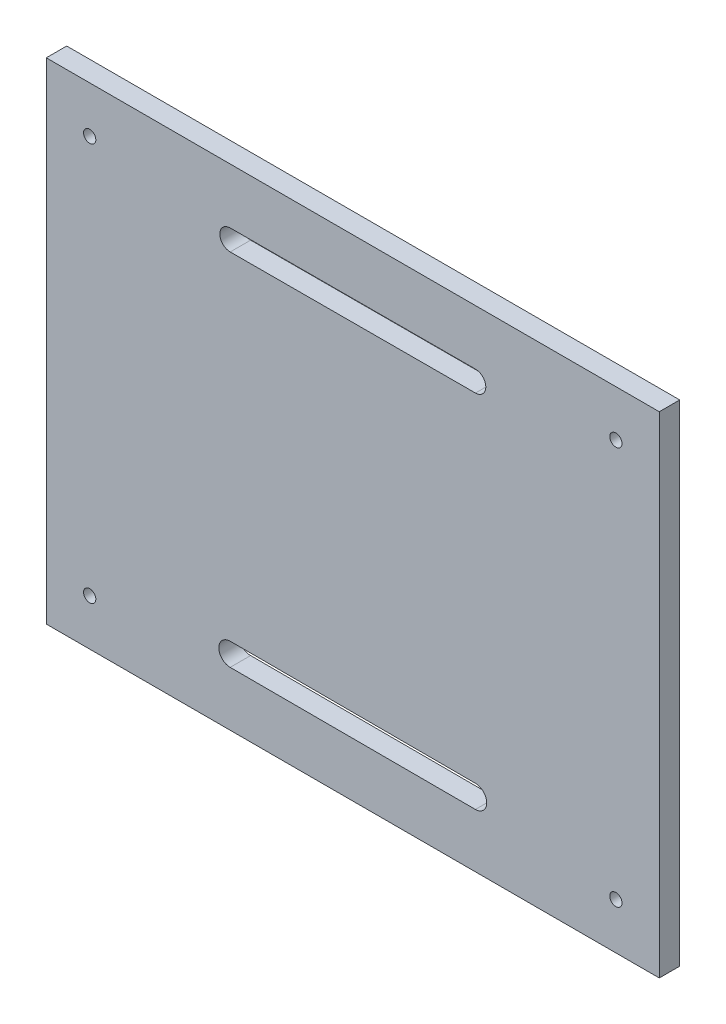
ISO-10303-21;
HEADER;
FILE_DESCRIPTION(('STEP AP214'),'2;1');
FILE_NAME('part.step','',(''),(''),'','','');
FILE_SCHEMA(('AUTOMOTIVE_DESIGN { 1 0 10303 214 1 1 1 1 }'));
ENDSEC;
DATA;
#1=APPLICATION_CONTEXT('core data for automotive mechanical design processes');
#2=APPLICATION_PROTOCOL_DEFINITION('international standard','automotive_design',2000,#1);
#3=PRODUCT_CONTEXT('',#1,'mechanical');
#4=PRODUCT('Part','Part','',(#3));
#5=PRODUCT_RELATED_PRODUCT_CATEGORY('part','',(#4));
#6=PRODUCT_DEFINITION_FORMATION('','',#4);
#7=PRODUCT_DEFINITION_CONTEXT('part definition',#1,'design');
#8=PRODUCT_DEFINITION('design','',#6,#7);
#9=PRODUCT_DEFINITION_SHAPE('','',#8);
#10=(LENGTH_UNIT() NAMED_UNIT(*) SI_UNIT(.MILLI.,.METRE.));
#11=(NAMED_UNIT(*) PLANE_ANGLE_UNIT() SI_UNIT($,.RADIAN.));
#12=(NAMED_UNIT(*) SI_UNIT($,.STERADIAN.) SOLID_ANGLE_UNIT());
#13=UNCERTAINTY_MEASURE_WITH_UNIT(LENGTH_MEASURE(1.E-05),#10,'distance_accuracy_value','');
#14=(GEOMETRIC_REPRESENTATION_CONTEXT(3) GLOBAL_UNCERTAINTY_ASSIGNED_CONTEXT((#13)) GLOBAL_UNIT_ASSIGNED_CONTEXT((#10,
#11,#12)) REPRESENTATION_CONTEXT('',''));
#15=CARTESIAN_POINT('',(0.,0.,0.));
#16=DIRECTION('',(0.,0.,1.));
#17=DIRECTION('',(1.,0.,0.));
#18=AXIS2_PLACEMENT_3D('',#15,#16,#17);
#19=CARTESIAN_POINT('',(0.,129.1430839934,5.));
#20=DIRECTION('',(0.,-1.,0.));
#21=DIRECTION('',(0.,0.,-1.));
#22=AXIS2_PLACEMENT_3D('',#19,#20,#21);
#23=PLANE('',#22);
#24=DIRECTION('',(-1.,0.,0.));
#25=VECTOR('',#24,1.);
#26=CARTESIAN_POINT('',(0.,129.1430839934,0.));
#27=LINE('',#26,#25);
#28=CARTESIAN_POINT('',(161.55561228383,129.1430839934,0.));
#29=VERTEX_POINT('',#28);
#30=CARTESIAN_POINT('',(11.5556122838298,129.1430839934,0.));
#31=VERTEX_POINT('',#30);
#32=EDGE_CURVE('E229',#29,#31,#27,.T.);
#33=ORIENTED_EDGE('',*,*,#32,.T.);
#34=DIRECTION('',(0.,0.,-1.));
#35=VECTOR('',#34,1.);
#36=CARTESIAN_POINT('',(11.5556122838298,129.1430839934,5.));
#37=LINE('',#36,#35);
#38=CARTESIAN_POINT('',(11.5556122838298,129.1430839934,5.));
#39=VERTEX_POINT('',#38);
#40=EDGE_CURVE('E11',#39,#31,#37,.T.);
#41=ORIENTED_EDGE('',*,*,#40,.F.);
#42=DIRECTION('',(-1.,0.,0.));
#43=VECTOR('',#42,1.);
#44=CARTESIAN_POINT('',(0.,129.1430839934,5.));
#45=LINE('',#44,#43);
#46=CARTESIAN_POINT('',(161.55561228383,129.1430839934,5.));
#47=VERTEX_POINT('',#46);
#48=EDGE_CURVE('E208',#47,#39,#45,.T.);
#49=ORIENTED_EDGE('',*,*,#48,.F.);
#50=DIRECTION('',(0.,0.,-1.));
#51=VECTOR('',#50,1.);
#52=CARTESIAN_POINT('',(161.55561228383,129.1430839934,5.));
#53=LINE('',#52,#51);
#54=EDGE_CURVE('E217',#47,#29,#53,.T.);
#55=ORIENTED_EDGE('',*,*,#54,.T.);
#56=EDGE_LOOP('',(#33,#41,#49,#55));
#57=FACE_BOUND('',#56,.T.);
#58=ADVANCED_FACE('F37',(#57),#23,.F.);
#59=CARTESIAN_POINT('',(11.5556122838298,0.,5.));
#60=DIRECTION('',(1.,0.,0.));
#61=DIRECTION('',(0.,0.,-1.));
#62=AXIS2_PLACEMENT_3D('',#59,#60,#61);
#63=PLANE('',#62);
#64=DIRECTION('',(0.,-1.,0.));
#65=VECTOR('',#64,1.);
#66=CARTESIAN_POINT('',(11.5556122838298,0.,0.));
#67=LINE('',#66,#65);
#68=CARTESIAN_POINT('',(11.5556122838298,9.14308399340018,0.));
#69=VERTEX_POINT('',#68);
#70=EDGE_CURVE('E232',#31,#69,#67,.T.);
#71=ORIENTED_EDGE('',*,*,#70,.T.);
#72=DIRECTION('',(0.,0.,-1.));
#73=VECTOR('',#72,1.);
#74=CARTESIAN_POINT('',(11.5556122838298,9.14308399340018,5.));
#75=LINE('',#74,#73);
#76=CARTESIAN_POINT('',(11.5556122838298,9.14308399340018,5.));
#77=VERTEX_POINT('',#76);
#78=EDGE_CURVE('E45',#77,#69,#75,.T.);
#79=ORIENTED_EDGE('',*,*,#78,.F.);
#80=DIRECTION('',(0.,-1.,0.));
#81=VECTOR('',#80,1.);
#82=CARTESIAN_POINT('',(11.5556122838298,0.,5.));
#83=LINE('',#82,#81);
#84=EDGE_CURVE('E211',#39,#77,#83,.T.);
#85=ORIENTED_EDGE('',*,*,#84,.F.);
#86=ORIENTED_EDGE('',*,*,#40,.T.);
#87=EDGE_LOOP('',(#71,#79,#85,#86));
#88=FACE_BOUND('',#87,.T.);
#89=ADVANCED_FACE('F261',(#88),#63,.F.);
#90=CARTESIAN_POINT('',(0.,9.14308399340018,5.));
#91=DIRECTION('',(0.,1.,0.));
#92=DIRECTION('',(-1.,0.,0.));
#93=AXIS2_PLACEMENT_3D('',#90,#91,#92);
#94=PLANE('',#93);
#95=DIRECTION('',(1.,0.,0.));
#96=VECTOR('',#95,1.);
#97=CARTESIAN_POINT('',(0.,9.14308399340018,0.));
#98=LINE('',#97,#96);
#99=CARTESIAN_POINT('',(161.55561228383,9.14308399340018,0.));
#100=VERTEX_POINT('',#99);
#101=EDGE_CURVE('E234',#69,#100,#98,.T.);
#102=ORIENTED_EDGE('',*,*,#101,.T.);
#103=DIRECTION('',(0.,0.,-1.));
#104=VECTOR('',#103,1.);
#105=CARTESIAN_POINT('',(161.55561228383,9.14308399340018,5.));
#106=LINE('',#105,#104);
#107=CARTESIAN_POINT('',(161.55561228383,9.14308399340018,5.));
#108=VERTEX_POINT('',#107);
#109=EDGE_CURVE('E239',#108,#100,#106,.T.);
#110=ORIENTED_EDGE('',*,*,#109,.F.);
#111=DIRECTION('',(1.,0.,0.));
#112=VECTOR('',#111,1.);
#113=CARTESIAN_POINT('',(0.,9.14308399340018,5.));
#114=LINE('',#113,#112);
#115=EDGE_CURVE('E213',#77,#108,#114,.T.);
#116=ORIENTED_EDGE('',*,*,#115,.F.);
#117=ORIENTED_EDGE('',*,*,#78,.T.);
#118=EDGE_LOOP('',(#102,#110,#116,#117));
#119=FACE_BOUND('',#118,.T.);
#120=ADVANCED_FACE('F246',(#119),#94,.F.);
#121=CARTESIAN_POINT('',(22.1789860171417,117.822854056985,5.));
#122=DIRECTION('',(0.,0.,-1.));
#123=DIRECTION('',(-1.,0.,0.));
#124=AXIS2_PLACEMENT_3D('',#121,#122,#123);
#125=CYLINDRICAL_SURFACE('',#124,1.5);
#126=CARTESIAN_POINT('',(22.1789860171417,117.822854056985,5.));
#127=DIRECTION('',(0.,0.,1.));
#128=DIRECTION('',(1.,0.,0.));
#129=AXIS2_PLACEMENT_3D('',#126,#127,#128);
#130=CIRCLE('',#129,1.5);
#131=CARTESIAN_POINT('',(23.6789860171417,117.822854056985,5.));
#132=VERTEX_POINT('',#131);
#133=EDGE_CURVE('E205',#132,#132,#130,.T.);
#134=ORIENTED_EDGE('',*,*,#133,.T.);
#135=EDGE_LOOP('',(#134));
#136=FACE_BOUND('',#135,.T.);
#137=CARTESIAN_POINT('',(22.1789860171417,117.822854056985,0.));
#138=DIRECTION('',(0.,0.,1.));
#139=DIRECTION('',(1.,0.,0.));
#140=AXIS2_PLACEMENT_3D('',#137,#138,#139);
#141=CIRCLE('',#140,1.5);
#142=CARTESIAN_POINT('',(23.6789860171417,117.822854056985,0.));
#143=VERTEX_POINT('',#142);
#144=EDGE_CURVE('E226',#143,#143,#141,.T.);
#145=ORIENTED_EDGE('',*,*,#144,.F.);
#146=EDGE_LOOP('',(#145));
#147=FACE_BOUND('',#146,.T.);
#148=ADVANCED_FACE('F268',(#136,#147),#125,.F.);
#149=CARTESIAN_POINT('',(150.932238550518,117.822854056985,5.));
#150=DIRECTION('',(0.,0.,-1.));
#151=DIRECTION('',(-1.,0.,0.));
#152=AXIS2_PLACEMENT_3D('',#149,#150,#151);
#153=CYLINDRICAL_SURFACE('',#152,1.5);
#154=CARTESIAN_POINT('',(150.932238550518,117.822854056985,5.));
#155=DIRECTION('',(0.,0.,1.));
#156=DIRECTION('',(1.,0.,0.));
#157=AXIS2_PLACEMENT_3D('',#154,#155,#156);
#158=CIRCLE('',#157,1.5);
#159=CARTESIAN_POINT('',(152.432238550518,117.822854056985,5.));
#160=VERTEX_POINT('',#159);
#161=EDGE_CURVE('E202',#160,#160,#158,.T.);
#162=ORIENTED_EDGE('',*,*,#161,.T.);
#163=EDGE_LOOP('',(#162));
#164=FACE_BOUND('',#163,.T.);
#165=CARTESIAN_POINT('',(150.932238550518,117.822854056985,0.));
#166=DIRECTION('',(0.,0.,1.));
#167=DIRECTION('',(1.,0.,0.));
#168=AXIS2_PLACEMENT_3D('',#165,#166,#167);
#169=CIRCLE('',#168,1.5);
#170=CARTESIAN_POINT('',(152.432238550518,117.822854056985,0.));
#171=VERTEX_POINT('',#170);
#172=EDGE_CURVE('E223',#171,#171,#169,.T.);
#173=ORIENTED_EDGE('',*,*,#172,.F.);
#174=EDGE_LOOP('',(#173));
#175=FACE_BOUND('',#174,.T.);
#176=ADVANCED_FACE('F275',(#164,#175),#153,.F.);
#177=CARTESIAN_POINT('',(22.1789860171417,20.4633139298151,5.));
#178=DIRECTION('',(0.,0.,-1.));
#179=DIRECTION('',(-1.,0.,0.));
#180=AXIS2_PLACEMENT_3D('',#177,#178,#179);
#181=CYLINDRICAL_SURFACE('',#180,1.5);
#182=CARTESIAN_POINT('',(22.1789860171417,20.4633139298151,5.));
#183=DIRECTION('',(0.,0.,1.));
#184=DIRECTION('',(1.,0.,0.));
#185=AXIS2_PLACEMENT_3D('',#182,#183,#184);
#186=CIRCLE('',#185,1.5);
#187=CARTESIAN_POINT('',(23.6789860171417,20.4633139298151,5.));
#188=VERTEX_POINT('',#187);
#189=EDGE_CURVE('E198',#188,#188,#186,.T.);
#190=ORIENTED_EDGE('',*,*,#189,.T.);
#191=EDGE_LOOP('',(#190));
#192=FACE_BOUND('',#191,.T.);
#193=CARTESIAN_POINT('',(22.1789860171417,20.4633139298151,0.));
#194=DIRECTION('',(0.,0.,1.));
#195=DIRECTION('',(1.,0.,0.));
#196=AXIS2_PLACEMENT_3D('',#193,#194,#195);
#197=CIRCLE('',#196,1.5);
#198=CARTESIAN_POINT('',(23.6789860171417,20.4633139298151,0.));
#199=VERTEX_POINT('',#198);
#200=EDGE_CURVE('E220',#199,#199,#197,.T.);
#201=ORIENTED_EDGE('',*,*,#200,.F.);
#202=EDGE_LOOP('',(#201));
#203=FACE_BOUND('',#202,.T.);
#204=ADVANCED_FACE('F278',(#192,#203),#181,.F.);
#205=CARTESIAN_POINT('',(150.932238550518,20.4633139298151,5.));
#206=DIRECTION('',(0.,0.,-1.));
#207=DIRECTION('',(-1.,0.,0.));
#208=AXIS2_PLACEMENT_3D('',#205,#206,#207);
#209=CYLINDRICAL_SURFACE('',#208,1.5);
#210=CARTESIAN_POINT('',(150.932238550518,20.4633139298151,5.));
#211=DIRECTION('',(0.,0.,1.));
#212=DIRECTION('',(1.,0.,0.));
#213=AXIS2_PLACEMENT_3D('',#210,#211,#212);
#214=CIRCLE('',#213,1.5);
#215=CARTESIAN_POINT('',(152.432238550518,20.4633139298151,5.));
#216=VERTEX_POINT('',#215);
#217=EDGE_CURVE('E195',#216,#216,#214,.T.);
#218=ORIENTED_EDGE('',*,*,#217,.T.);
#219=EDGE_LOOP('',(#218));
#220=FACE_BOUND('',#219,.T.);
#221=CARTESIAN_POINT('',(150.932238550518,20.4633139298151,0.));
#222=DIRECTION('',(0.,0.,1.));
#223=DIRECTION('',(1.,0.,0.));
#224=AXIS2_PLACEMENT_3D('',#221,#222,#223);
#225=CIRCLE('',#224,1.5);
#226=CARTESIAN_POINT('',(152.432238550518,20.4633139298151,0.));
#227=VERTEX_POINT('',#226);
#228=EDGE_CURVE('E188',#227,#227,#225,.T.);
#229=ORIENTED_EDGE('',*,*,#228,.F.);
#230=EDGE_LOOP('',(#229));
#231=FACE_BOUND('',#230,.T.);
#232=ADVANCED_FACE('F39',(#220,#231),#209,.F.);
#233=CARTESIAN_POINT('',(161.55561228383,0.,5.));
#234=DIRECTION('',(-1.,0.,0.));
#235=DIRECTION('',(0.,0.,1.));
#236=AXIS2_PLACEMENT_3D('',#233,#234,#235);
#237=PLANE('',#236);
#238=DIRECTION('',(0.,1.,0.));
#239=VECTOR('',#238,1.);
#240=CARTESIAN_POINT('',(161.55561228383,0.,0.));
#241=LINE('',#240,#239);
#242=EDGE_CURVE('E199',#100,#29,#241,.T.);
#243=ORIENTED_EDGE('',*,*,#242,.T.);
#244=ORIENTED_EDGE('',*,*,#54,.F.);
#245=DIRECTION('',(0.,1.,0.));
#246=VECTOR('',#245,1.);
#247=CARTESIAN_POINT('',(161.55561228383,0.,5.));
#248=LINE('',#247,#246);
#249=EDGE_CURVE('E215',#108,#47,#248,.T.);
#250=ORIENTED_EDGE('',*,*,#249,.F.);
#251=ORIENTED_EDGE('',*,*,#109,.T.);
#252=EDGE_LOOP('',(#243,#244,#250,#251));
#253=FACE_BOUND('',#252,.T.);
#254=ADVANCED_FACE('F254',(#253),#237,.F.);
#255=CARTESIAN_POINT('',(0.,0.,5.));
#256=DIRECTION('',(0.,0.,1.));
#257=DIRECTION('',(1.,0.,0.));
#258=AXIS2_PLACEMENT_3D('',#255,#256,#257);
#259=PLANE('',#258);
#260=CARTESIAN_POINT('',(56.5556122838298,25.241072317324,5.));
#261=DIRECTION('',(0.,0.,1.));
#262=DIRECTION('',(1.,0.,0.));
#263=AXIS2_PLACEMENT_3D('',#260,#261,#262);
#264=CIRCLE('',#263,2.76982186800688);
#265=CARTESIAN_POINT('',(56.5604841041237,28.0108899008222,5.));
#266=VERTEX_POINT('',#265);
#267=CARTESIAN_POINT('',(56.5507404635359,22.4712547338257,5.));
#268=VERTEX_POINT('',#267);
#269=EDGE_CURVE('E52',#266,#268,#264,.T.);
#270=ORIENTED_EDGE('',*,*,#269,.F.);
#271=DIRECTION('',(-0.999998453146512,0.00175889299964881,0.));
#272=VECTOR('',#271,1.);
#273=CARTESIAN_POINT('',(56.5604841041237,28.0108899008222,5.));
#274=LINE('',#273,#272);
#275=CARTESIAN_POINT('',(116.569279871962,27.9053406867597,5.));
#276=VERTEX_POINT('',#275);
#277=EDGE_CURVE('E144',#276,#266,#274,.T.);
#278=ORIENTED_EDGE('',*,*,#277,.F.);
#279=CARTESIAN_POINT('',(116.564408051668,25.1355231032614,5.));
#280=DIRECTION('',(0.,0.,1.));
#281=DIRECTION('',(1.,0.,0.));
#282=AXIS2_PLACEMENT_3D('',#279,#280,#281);
#283=CIRCLE('',#282,2.76982186800688);
#284=CARTESIAN_POINT('',(116.559536231374,22.3657055197631,5.));
#285=VERTEX_POINT('',#284);
#286=EDGE_CURVE('E147',#285,#276,#283,.T.);
#287=ORIENTED_EDGE('',*,*,#286,.F.);
#288=DIRECTION('',(0.999998453146512,-0.00175889299964881,0.));
#289=VECTOR('',#288,1.);
#290=CARTESIAN_POINT('',(56.5507404635359,22.4712547338257,5.));
#291=LINE('',#290,#289);
#292=EDGE_CURVE('E153',#268,#285,#291,.T.);
#293=ORIENTED_EDGE('',*,*,#292,.F.);
#294=EDGE_LOOP('',(#270,#278,#287,#293));
#295=FACE_BOUND('',#294,.T.);
#296=CARTESIAN_POINT('',(56.5556122838298,113.045095669476,5.));
#297=DIRECTION('',(0.,0.,1.));
#298=DIRECTION('',(1.,0.,0.));
#299=AXIS2_PLACEMENT_3D('',#296,#297,#298);
#300=CIRCLE('',#299,2.5405055961708);
#301=CARTESIAN_POINT('',(56.5511438063211,115.585597335857,5.));
#302=VERTEX_POINT('',#301);
#303=CARTESIAN_POINT('',(56.5600807613384,110.504594003096,5.));
#304=VERTEX_POINT('',#303);
#305=EDGE_CURVE('E159',#302,#304,#300,.T.);
#306=ORIENTED_EDGE('',*,*,#305,.F.);
#307=DIRECTION('',(-0.999998453146512,-0.00175889299964893,0.));
#308=VECTOR('',#307,1.);
#309=CARTESIAN_POINT('',(56.5511438063211,115.585597335857,5.));
#310=LINE('',#309,#308);
#311=CARTESIAN_POINT('',(116.55993957416,115.69114654992,5.));
#312=VERTEX_POINT('',#311);
#313=EDGE_CURVE('E167',#312,#302,#310,.T.);
#314=ORIENTED_EDGE('',*,*,#313,.F.);
#315=CARTESIAN_POINT('',(116.564408051668,113.150644883539,5.));
#316=DIRECTION('',(0.,0.,1.));
#317=DIRECTION('',(1.,0.,0.));
#318=AXIS2_PLACEMENT_3D('',#315,#316,#317);
#319=CIRCLE('',#318,2.5405055961708);
#320=CARTESIAN_POINT('',(116.568876529177,110.610143217158,5.));
#321=VERTEX_POINT('',#320);
#322=EDGE_CURVE('E181',#321,#312,#319,.T.);
#323=ORIENTED_EDGE('',*,*,#322,.F.);
#324=DIRECTION('',(0.999998453146512,0.00175889299964893,0.));
#325=VECTOR('',#324,1.);
#326=CARTESIAN_POINT('',(56.5600807613384,110.504594003096,5.));
#327=LINE('',#326,#325);
#328=EDGE_CURVE('E178',#304,#321,#327,.T.);
#329=ORIENTED_EDGE('',*,*,#328,.F.);
#330=EDGE_LOOP('',(#306,#314,#323,#329));
#331=FACE_BOUND('',#330,.T.);
#332=ORIENTED_EDGE('',*,*,#217,.F.);
#333=EDGE_LOOP('',(#332));
#334=FACE_BOUND('',#333,.T.);
#335=ORIENTED_EDGE('',*,*,#189,.F.);
#336=EDGE_LOOP('',(#335));
#337=FACE_BOUND('',#336,.T.);
#338=ORIENTED_EDGE('',*,*,#161,.F.);
#339=EDGE_LOOP('',(#338));
#340=FACE_BOUND('',#339,.T.);
#341=ORIENTED_EDGE('',*,*,#133,.F.);
#342=EDGE_LOOP('',(#341));
#343=FACE_BOUND('',#342,.T.);
#344=ORIENTED_EDGE('',*,*,#48,.T.);
#345=ORIENTED_EDGE('',*,*,#84,.T.);
#346=ORIENTED_EDGE('',*,*,#115,.T.);
#347=ORIENTED_EDGE('',*,*,#249,.T.);
#348=EDGE_LOOP('',(#344,#345,#346,#347));
#349=FACE_BOUND('',#348,.T.);
#350=ADVANCED_FACE('F260',(#295,#331,#334,#337,#340,#343,#349),#259,.T.);
#351=CARTESIAN_POINT('',(0.,0.,0.));
#352=DIRECTION('',(0.,0.,1.));
#353=DIRECTION('',(1.,0.,0.));
#354=AXIS2_PLACEMENT_3D('',#351,#352,#353);
#355=PLANE('',#354);
#356=DIRECTION('',(-0.999998453146512,0.00175889299964881,0.));
#357=VECTOR('',#356,1.);
#358=CARTESIAN_POINT('',(56.5604841041237,28.0108899008222,0.));
#359=LINE('',#358,#357);
#360=CARTESIAN_POINT('',(116.569279871962,27.9053406867597,0.));
#361=VERTEX_POINT('',#360);
#362=CARTESIAN_POINT('',(56.5604841041237,28.0108899008222,0.));
#363=VERTEX_POINT('',#362);
#364=EDGE_CURVE('E134',#361,#363,#359,.T.);
#365=ORIENTED_EDGE('',*,*,#364,.T.);
#366=CARTESIAN_POINT('',(56.5556122838298,25.241072317324,0.));
#367=DIRECTION('',(0.,0.,1.));
#368=DIRECTION('',(1.,0.,0.));
#369=AXIS2_PLACEMENT_3D('',#366,#367,#368);
#370=CIRCLE('',#369,2.76982186800688);
#371=CARTESIAN_POINT('',(56.5507404635359,22.4712547338257,0.));
#372=VERTEX_POINT('',#371);
#373=EDGE_CURVE('E128',#363,#372,#370,.T.);
#374=ORIENTED_EDGE('',*,*,#373,.T.);
#375=DIRECTION('',(0.999998453146512,-0.00175889299964881,0.));
#376=VECTOR('',#375,1.);
#377=CARTESIAN_POINT('',(56.5507404635359,22.4712547338257,0.));
#378=LINE('',#377,#376);
#379=CARTESIAN_POINT('',(116.559536231374,22.3657055197631,0.));
#380=VERTEX_POINT('',#379);
#381=EDGE_CURVE('E137',#372,#380,#378,.T.);
#382=ORIENTED_EDGE('',*,*,#381,.T.);
#383=CARTESIAN_POINT('',(116.564408051668,25.1355231032614,0.));
#384=DIRECTION('',(0.,0.,1.));
#385=DIRECTION('',(1.,0.,0.));
#386=AXIS2_PLACEMENT_3D('',#383,#384,#385);
#387=CIRCLE('',#386,2.76982186800688);
#388=EDGE_CURVE('E60',#380,#361,#387,.T.);
#389=ORIENTED_EDGE('',*,*,#388,.T.);
#390=EDGE_LOOP('',(#365,#374,#382,#389));
#391=FACE_BOUND('',#390,.T.);
#392=DIRECTION('',(-0.999998453146512,-0.00175889299964893,0.));
#393=VECTOR('',#392,1.);
#394=CARTESIAN_POINT('',(56.5511438063211,115.585597335857,0.));
#395=LINE('',#394,#393);
#396=CARTESIAN_POINT('',(116.55993957416,115.69114654992,0.));
#397=VERTEX_POINT('',#396);
#398=CARTESIAN_POINT('',(56.5511438063211,115.585597335857,0.));
#399=VERTEX_POINT('',#398);
#400=EDGE_CURVE('E173',#397,#399,#395,.T.);
#401=ORIENTED_EDGE('',*,*,#400,.T.);
#402=CARTESIAN_POINT('',(56.5556122838298,113.045095669476,0.));
#403=DIRECTION('',(0.,0.,1.));
#404=DIRECTION('',(1.,0.,0.));
#405=AXIS2_PLACEMENT_3D('',#402,#403,#404);
#406=CIRCLE('',#405,2.5405055961708);
#407=CARTESIAN_POINT('',(56.5600807613384,110.504594003096,0.));
#408=VERTEX_POINT('',#407);
#409=EDGE_CURVE('E163',#399,#408,#406,.T.);
#410=ORIENTED_EDGE('',*,*,#409,.T.);
#411=DIRECTION('',(0.999998453146512,0.00175889299964893,0.));
#412=VECTOR('',#411,1.);
#413=CARTESIAN_POINT('',(56.5600807613384,110.504594003096,0.));
#414=LINE('',#413,#412);
#415=CARTESIAN_POINT('',(116.568876529177,110.610143217158,0.));
#416=VERTEX_POINT('',#415);
#417=EDGE_CURVE('E166',#408,#416,#414,.T.);
#418=ORIENTED_EDGE('',*,*,#417,.T.);
#419=CARTESIAN_POINT('',(116.564408051668,113.150644883539,0.));
#420=DIRECTION('',(0.,0.,1.));
#421=DIRECTION('',(1.,0.,0.));
#422=AXIS2_PLACEMENT_3D('',#419,#420,#421);
#423=CIRCLE('',#422,2.5405055961708);
#424=EDGE_CURVE('E170',#416,#397,#423,.T.);
#425=ORIENTED_EDGE('',*,*,#424,.T.);
#426=EDGE_LOOP('',(#401,#410,#418,#425));
#427=FACE_BOUND('',#426,.T.);
#428=ORIENTED_EDGE('',*,*,#228,.T.);
#429=EDGE_LOOP('',(#428));
#430=FACE_BOUND('',#429,.T.);
#431=ORIENTED_EDGE('',*,*,#200,.T.);
#432=EDGE_LOOP('',(#431));
#433=FACE_BOUND('',#432,.T.);
#434=ORIENTED_EDGE('',*,*,#172,.T.);
#435=EDGE_LOOP('',(#434));
#436=FACE_BOUND('',#435,.T.);
#437=ORIENTED_EDGE('',*,*,#144,.T.);
#438=EDGE_LOOP('',(#437));
#439=FACE_BOUND('',#438,.T.);
#440=ORIENTED_EDGE('',*,*,#32,.F.);
#441=ORIENTED_EDGE('',*,*,#242,.F.);
#442=ORIENTED_EDGE('',*,*,#101,.F.);
#443=ORIENTED_EDGE('',*,*,#70,.F.);
#444=EDGE_LOOP('',(#440,#441,#442,#443));
#445=FACE_BOUND('',#444,.T.);
#446=ADVANCED_FACE('F141',(#391,#427,#430,#433,#436,#439,#445),#355,.F.);
#447=CARTESIAN_POINT('',(56.5556122838298,113.045095669476,0.));
#448=DIRECTION('',(0.,0.,1.));
#449=DIRECTION('',(1.,0.,0.));
#450=AXIS2_PLACEMENT_3D('',#447,#448,#449);
#451=CYLINDRICAL_SURFACE('',#450,2.5405055961708);
#452=ORIENTED_EDGE('',*,*,#305,.T.);
#453=DIRECTION('',(0.,0.,1.));
#454=VECTOR('',#453,1.);
#455=CARTESIAN_POINT('',(56.5600807613384,110.504594003096,0.));
#456=LINE('',#455,#454);
#457=EDGE_CURVE('E176',#408,#304,#456,.T.);
#458=ORIENTED_EDGE('',*,*,#457,.F.);
#459=ORIENTED_EDGE('',*,*,#409,.F.);
#460=DIRECTION('',(0.,0.,1.));
#461=VECTOR('',#460,1.);
#462=CARTESIAN_POINT('',(56.5511438063211,115.585597335857,0.));
#463=LINE('',#462,#461);
#464=EDGE_CURVE('E186',#399,#302,#463,.T.);
#465=ORIENTED_EDGE('',*,*,#464,.T.);
#466=EDGE_LOOP('',(#452,#458,#459,#465));
#467=FACE_BOUND('',#466,.T.);
#468=ADVANCED_FACE('F292',(#467),#451,.F.);
#469=CARTESIAN_POINT('',(56.5511438063211,115.585597335857,0.));
#470=DIRECTION('',(-0.00175889299964893,0.999998453146511,0.));
#471=DIRECTION('',(-0.999998453146512,-0.00175889299964893,0.));
#472=AXIS2_PLACEMENT_3D('',#469,#470,#471);
#473=PLANE('',#472);
#474=ORIENTED_EDGE('',*,*,#313,.T.);
#475=ORIENTED_EDGE('',*,*,#464,.F.);
#476=ORIENTED_EDGE('',*,*,#400,.F.);
#477=DIRECTION('',(0.,0.,1.));
#478=VECTOR('',#477,1.);
#479=CARTESIAN_POINT('',(116.55993957416,115.69114654992,0.));
#480=LINE('',#479,#478);
#481=EDGE_CURVE('E189',#397,#312,#480,.T.);
#482=ORIENTED_EDGE('',*,*,#481,.T.);
#483=EDGE_LOOP('',(#474,#475,#476,#482));
#484=FACE_BOUND('',#483,.T.);
#485=ADVANCED_FACE('F303',(#484),#473,.F.);
#486=CARTESIAN_POINT('',(116.564408051668,113.150644883539,0.));
#487=DIRECTION('',(0.,0.,1.));
#488=DIRECTION('',(1.,0.,0.));
#489=AXIS2_PLACEMENT_3D('',#486,#487,#488);
#490=CYLINDRICAL_SURFACE('',#489,2.5405055961708);
#491=ORIENTED_EDGE('',*,*,#322,.T.);
#492=ORIENTED_EDGE('',*,*,#481,.F.);
#493=ORIENTED_EDGE('',*,*,#424,.F.);
#494=DIRECTION('',(0.,0.,1.));
#495=VECTOR('',#494,1.);
#496=CARTESIAN_POINT('',(116.568876529177,110.610143217158,0.));
#497=LINE('',#496,#495);
#498=EDGE_CURVE('E191',#416,#321,#497,.T.);
#499=ORIENTED_EDGE('',*,*,#498,.T.);
#500=EDGE_LOOP('',(#491,#492,#493,#499));
#501=FACE_BOUND('',#500,.T.);
#502=ADVANCED_FACE('F336',(#501),#490,.F.);
#503=CARTESIAN_POINT('',(56.5600807613384,110.504594003096,0.));
#504=DIRECTION('',(0.00175889299964893,-0.999998453146511,0.));
#505=DIRECTION('',(0.999998453146512,0.00175889299964893,0.));
#506=AXIS2_PLACEMENT_3D('',#503,#504,#505);
#507=PLANE('',#506);
#508=ORIENTED_EDGE('',*,*,#328,.T.);
#509=ORIENTED_EDGE('',*,*,#498,.F.);
#510=ORIENTED_EDGE('',*,*,#417,.F.);
#511=ORIENTED_EDGE('',*,*,#457,.T.);
#512=EDGE_LOOP('',(#508,#509,#510,#511));
#513=FACE_BOUND('',#512,.T.);
#514=ADVANCED_FACE('F346',(#513),#507,.F.);
#515=CARTESIAN_POINT('',(56.5556122838298,25.241072317324,0.));
#516=DIRECTION('',(0.,0.,1.));
#517=DIRECTION('',(1.,0.,0.));
#518=AXIS2_PLACEMENT_3D('',#515,#516,#517);
#519=CYLINDRICAL_SURFACE('',#518,2.76982186800688);
#520=ORIENTED_EDGE('',*,*,#269,.T.);
#521=DIRECTION('',(0.,0.,1.));
#522=VECTOR('',#521,1.);
#523=CARTESIAN_POINT('',(56.5507404635359,22.4712547338257,0.));
#524=LINE('',#523,#522);
#525=EDGE_CURVE('E124',#372,#268,#524,.T.);
#526=ORIENTED_EDGE('',*,*,#525,.F.);
#527=ORIENTED_EDGE('',*,*,#373,.F.);
#528=DIRECTION('',(0.,0.,1.));
#529=VECTOR('',#528,1.);
#530=CARTESIAN_POINT('',(56.5604841041237,28.0108899008222,0.));
#531=LINE('',#530,#529);
#532=EDGE_CURVE('E157',#363,#266,#531,.T.);
#533=ORIENTED_EDGE('',*,*,#532,.T.);
#534=EDGE_LOOP('',(#520,#526,#527,#533));
#535=FACE_BOUND('',#534,.T.);
#536=ADVANCED_FACE('F126',(#535),#519,.F.);
#537=CARTESIAN_POINT('',(56.5604841041237,28.0108899008222,0.));
#538=DIRECTION('',(0.00175889299964881,0.999998453146511,0.));
#539=DIRECTION('',(-0.999998453146512,0.00175889299964881,0.));
#540=AXIS2_PLACEMENT_3D('',#537,#538,#539);
#541=PLANE('',#540);
#542=ORIENTED_EDGE('',*,*,#277,.T.);
#543=ORIENTED_EDGE('',*,*,#532,.F.);
#544=ORIENTED_EDGE('',*,*,#364,.F.);
#545=DIRECTION('',(0.,0.,1.));
#546=VECTOR('',#545,1.);
#547=CARTESIAN_POINT('',(116.569279871962,27.9053406867597,0.));
#548=LINE('',#547,#546);
#549=EDGE_CURVE('E160',#361,#276,#548,.T.);
#550=ORIENTED_EDGE('',*,*,#549,.T.);
#551=EDGE_LOOP('',(#542,#543,#544,#550));
#552=FACE_BOUND('',#551,.T.);
#553=ADVANCED_FACE('F365',(#552),#541,.F.);
#554=CARTESIAN_POINT('',(116.564408051668,25.1355231032614,0.));
#555=DIRECTION('',(0.,0.,1.));
#556=DIRECTION('',(1.,0.,0.));
#557=AXIS2_PLACEMENT_3D('',#554,#555,#556);
#558=CYLINDRICAL_SURFACE('',#557,2.76982186800688);
#559=ORIENTED_EDGE('',*,*,#286,.T.);
#560=ORIENTED_EDGE('',*,*,#549,.F.);
#561=ORIENTED_EDGE('',*,*,#388,.F.);
#562=DIRECTION('',(0.,0.,1.));
#563=VECTOR('',#562,1.);
#564=CARTESIAN_POINT('',(116.559536231374,22.3657055197631,0.));
#565=LINE('',#564,#563);
#566=EDGE_CURVE('E133',#380,#285,#565,.T.);
#567=ORIENTED_EDGE('',*,*,#566,.T.);
#568=EDGE_LOOP('',(#559,#560,#561,#567));
#569=FACE_BOUND('',#568,.T.);
#570=ADVANCED_FACE('F374',(#569),#558,.F.);
#571=CARTESIAN_POINT('',(56.5507404635359,22.4712547338257,0.));
#572=DIRECTION('',(-0.00175889299964881,-0.999998453146511,0.));
#573=DIRECTION('',(0.999998453146512,-0.00175889299964881,0.));
#574=AXIS2_PLACEMENT_3D('',#571,#572,#573);
#575=PLANE('',#574);
#576=ORIENTED_EDGE('',*,*,#292,.T.);
#577=ORIENTED_EDGE('',*,*,#566,.F.);
#578=ORIENTED_EDGE('',*,*,#381,.F.);
#579=ORIENTED_EDGE('',*,*,#525,.T.);
#580=EDGE_LOOP('',(#576,#577,#578,#579));
#581=FACE_BOUND('',#580,.T.);
#582=ADVANCED_FACE('F138',(#581),#575,.F.);
#583=CLOSED_SHELL('',(#58,#89,#120,#148,#176,#204,#232,#254,#350,#446,#468,#485,#502,#514,#536,
#553,#570,#582));
#584=MANIFOLD_SOLID_BREP('B2',#583);
#585=ADVANCED_BREP_SHAPE_REPRESENTATION('',(#18,#584),#14);
#586=SHAPE_DEFINITION_REPRESENTATION(#9,#585);
ENDSEC;
END-ISO-10303-21;
